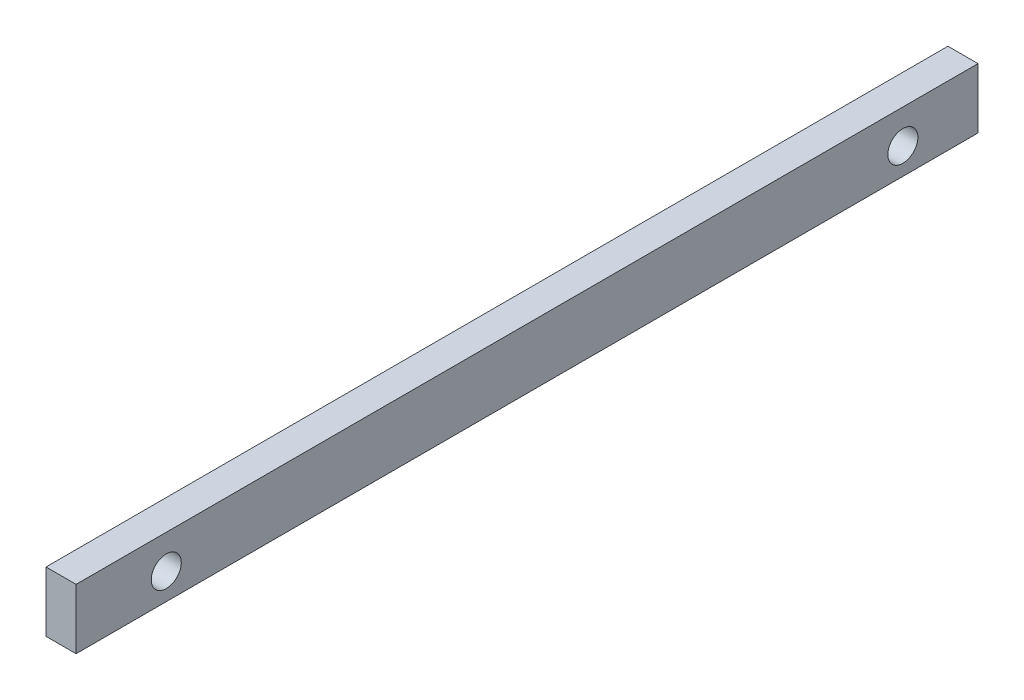
ISO-10303-21;
HEADER;
FILE_DESCRIPTION(('STEP AP214'),'2;1');
FILE_NAME('part.step','',(''),(''),'','','');
FILE_SCHEMA(('AUTOMOTIVE_DESIGN { 1 0 10303 214 1 1 1 1 }'));
ENDSEC;
DATA;
#1=APPLICATION_CONTEXT('core data for automotive mechanical design processes');
#2=APPLICATION_PROTOCOL_DEFINITION('international standard','automotive_design',2000,#1);
#3=PRODUCT_CONTEXT('',#1,'mechanical');
#4=PRODUCT('Part','Part','',(#3));
#5=PRODUCT_RELATED_PRODUCT_CATEGORY('part','',(#4));
#6=PRODUCT_DEFINITION_FORMATION('','',#4);
#7=PRODUCT_DEFINITION_CONTEXT('part definition',#1,'design');
#8=PRODUCT_DEFINITION('design','',#6,#7);
#9=PRODUCT_DEFINITION_SHAPE('','',#8);
#10=(LENGTH_UNIT() NAMED_UNIT(*) SI_UNIT(.MILLI.,.METRE.));
#11=(NAMED_UNIT(*) PLANE_ANGLE_UNIT() SI_UNIT($,.RADIAN.));
#12=(NAMED_UNIT(*) SI_UNIT($,.STERADIAN.) SOLID_ANGLE_UNIT());
#13=UNCERTAINTY_MEASURE_WITH_UNIT(LENGTH_MEASURE(1.E-05),#10,'distance_accuracy_value','');
#14=(GEOMETRIC_REPRESENTATION_CONTEXT(3) GLOBAL_UNCERTAINTY_ASSIGNED_CONTEXT((#13)) GLOBAL_UNIT_ASSIGNED_CONTEXT((#10,
#11,#12)) REPRESENTATION_CONTEXT('',''));
#15=CARTESIAN_POINT('',(0.,0.,0.));
#16=DIRECTION('',(0.,0.,1.));
#17=DIRECTION('',(1.,0.,0.));
#18=AXIS2_PLACEMENT_3D('',#15,#16,#17);
#19=CARTESIAN_POINT('',(4.,0.,0.));
#20=DIRECTION('',(1.,0.,0.));
#21=DIRECTION('',(0.,0.,-1.));
#22=AXIS2_PLACEMENT_3D('',#19,#20,#21);
#23=PLANE('',#22);
#24=CARTESIAN_POINT('',(4.,0.827466255373061,28.137341684183));
#25=DIRECTION('',(1.,0.,0.));
#26=DIRECTION('',(0.,0.,-1.));
#27=AXIS2_PLACEMENT_3D('',#24,#25,#26);
#28=CIRCLE('',#27,2.);
#29=CARTESIAN_POINT('',(4.,0.827466255373061,26.137341684183));
#30=VERTEX_POINT('',#29);
#31=EDGE_CURVE('E100',#30,#30,#28,.T.);
#32=ORIENTED_EDGE('',*,*,#31,.F.);
#33=EDGE_LOOP('',(#32));
#34=FACE_BOUND('',#33,.T.);
#35=DIRECTION('',(0.,-1.,0.));
#36=VECTOR('',#35,1.);
#37=CARTESIAN_POINT('',(4.,5.31595867682489,40.137341684183));
#38=LINE('',#37,#36);
#39=CARTESIAN_POINT('',(4.,5.31595867682489,40.137341684183));
#40=VERTEX_POINT('',#39);
#41=CARTESIAN_POINT('',(4.,-2.68404132317511,40.137341684183));
#42=VERTEX_POINT('',#41);
#43=EDGE_CURVE('E85',#40,#42,#38,.T.);
#44=ORIENTED_EDGE('',*,*,#43,.T.);
#45=DIRECTION('',(0.,0.,-1.));
#46=VECTOR('',#45,1.);
#47=CARTESIAN_POINT('',(4.,-2.68404132317511,40.137341684183));
#48=LINE('',#47,#46);
#49=CARTESIAN_POINT('',(4.,-2.68404132317511,-79.862658315817));
#50=VERTEX_POINT('',#49);
#51=EDGE_CURVE('E80',#42,#50,#48,.T.);
#52=ORIENTED_EDGE('',*,*,#51,.T.);
#53=DIRECTION('',(0.,1.,0.));
#54=VECTOR('',#53,1.);
#55=CARTESIAN_POINT('',(4.,5.31595867682489,-79.862658315817));
#56=LINE('',#55,#54);
#57=CARTESIAN_POINT('',(4.,5.31595867682489,-79.862658315817));
#58=VERTEX_POINT('',#57);
#59=EDGE_CURVE('E83',#50,#58,#56,.T.);
#60=ORIENTED_EDGE('',*,*,#59,.T.);
#61=DIRECTION('',(0.,0.,1.));
#62=VECTOR('',#61,1.);
#63=CARTESIAN_POINT('',(4.,5.31595867682489,40.137341684183));
#64=LINE('',#63,#62);
#65=EDGE_CURVE('E50',#58,#40,#64,.T.);
#66=ORIENTED_EDGE('',*,*,#65,.T.);
#67=EDGE_LOOP('',(#44,#52,#60,#66));
#68=FACE_BOUND('',#67,.T.);
#69=CARTESIAN_POINT('',(4.,0.827466255373088,-69.862658315817));
#70=DIRECTION('',(1.,0.,0.));
#71=DIRECTION('',(0.,0.,-1.));
#72=AXIS2_PLACEMENT_3D('',#69,#70,#71);
#73=CIRCLE('',#72,2.);
#74=CARTESIAN_POINT('',(4.,0.827466255373088,-71.862658315817));
#75=VERTEX_POINT('',#74);
#76=EDGE_CURVE('E115',#75,#75,#73,.T.);
#77=ORIENTED_EDGE('',*,*,#76,.F.);
#78=EDGE_LOOP('',(#77));
#79=FACE_BOUND('',#78,.T.);
#80=ADVANCED_FACE('F33',(#34,#68,#79),#23,.T.);
#81=CARTESIAN_POINT('',(0.,0.,0.));
#82=DIRECTION('',(1.,0.,0.));
#83=DIRECTION('',(0.,0.,-1.));
#84=AXIS2_PLACEMENT_3D('',#81,#82,#83);
#85=PLANE('',#84);
#86=DIRECTION('',(0.,-1.,0.));
#87=VECTOR('',#86,1.);
#88=CARTESIAN_POINT('',(0.,5.31595867682489,40.137341684183));
#89=LINE('',#88,#87);
#90=CARTESIAN_POINT('',(0.,5.31595867682489,40.137341684183));
#91=VERTEX_POINT('',#90);
#92=CARTESIAN_POINT('',(0.,-2.68404132317511,40.137341684183));
#93=VERTEX_POINT('',#92);
#94=EDGE_CURVE('E97',#91,#93,#89,.T.);
#95=ORIENTED_EDGE('',*,*,#94,.F.);
#96=DIRECTION('',(0.,0.,1.));
#97=VECTOR('',#96,1.);
#98=CARTESIAN_POINT('',(0.,5.31595867682489,40.137341684183));
#99=LINE('',#98,#97);
#100=CARTESIAN_POINT('',(0.,5.31595867682489,-79.862658315817));
#101=VERTEX_POINT('',#100);
#102=EDGE_CURVE('E73',#101,#91,#99,.T.);
#103=ORIENTED_EDGE('',*,*,#102,.F.);
#104=DIRECTION('',(0.,1.,0.));
#105=VECTOR('',#104,1.);
#106=CARTESIAN_POINT('',(0.,5.31595867682489,-79.862658315817));
#107=LINE('',#106,#105);
#108=CARTESIAN_POINT('',(0.,-2.68404132317511,-79.862658315817));
#109=VERTEX_POINT('',#108);
#110=EDGE_CURVE('E67',#109,#101,#107,.T.);
#111=ORIENTED_EDGE('',*,*,#110,.F.);
#112=DIRECTION('',(0.,0.,-1.));
#113=VECTOR('',#112,1.);
#114=CARTESIAN_POINT('',(0.,-2.68404132317511,40.137341684183));
#115=LINE('',#114,#113);
#116=EDGE_CURVE('E89',#93,#109,#115,.T.);
#117=ORIENTED_EDGE('',*,*,#116,.F.);
#118=EDGE_LOOP('',(#95,#103,#111,#117));
#119=FACE_BOUND('',#118,.T.);
#120=CARTESIAN_POINT('',(0.,0.827466255373061,28.137341684183));
#121=DIRECTION('',(1.,0.,0.));
#122=DIRECTION('',(0.,0.,-1.));
#123=AXIS2_PLACEMENT_3D('',#120,#121,#122);
#124=CIRCLE('',#123,2.);
#125=CARTESIAN_POINT('',(0.,0.827466255373061,26.137341684183));
#126=VERTEX_POINT('',#125);
#127=EDGE_CURVE('E112',#126,#126,#124,.T.);
#128=ORIENTED_EDGE('',*,*,#127,.T.);
#129=EDGE_LOOP('',(#128));
#130=FACE_BOUND('',#129,.T.);
#131=CARTESIAN_POINT('',(0.,0.827466255373088,-69.862658315817));
#132=DIRECTION('',(1.,0.,0.));
#133=DIRECTION('',(0.,0.,-1.));
#134=AXIS2_PLACEMENT_3D('',#131,#132,#133);
#135=CIRCLE('',#134,2.);
#136=CARTESIAN_POINT('',(0.,0.827466255373088,-71.862658315817));
#137=VERTEX_POINT('',#136);
#138=EDGE_CURVE('E118',#137,#137,#135,.T.);
#139=ORIENTED_EDGE('',*,*,#138,.T.);
#140=EDGE_LOOP('',(#139));
#141=FACE_BOUND('',#140,.T.);
#142=ADVANCED_FACE('F108',(#119,#130,#141),#85,.F.);
#143=CARTESIAN_POINT('',(4.,5.31595867682489,40.137341684183));
#144=DIRECTION('',(0.,0.,-1.));
#145=DIRECTION('',(-1.,0.,0.));
#146=AXIS2_PLACEMENT_3D('',#143,#144,#145);
#147=PLANE('',#146);
#148=ORIENTED_EDGE('',*,*,#94,.T.);
#149=DIRECTION('',(-1.,0.,0.));
#150=VECTOR('',#149,1.);
#151=CARTESIAN_POINT('',(4.,-2.68404132317511,40.137341684183));
#152=LINE('',#151,#150);
#153=EDGE_CURVE('E11',#42,#93,#152,.T.);
#154=ORIENTED_EDGE('',*,*,#153,.F.);
#155=ORIENTED_EDGE('',*,*,#43,.F.);
#156=DIRECTION('',(-1.,0.,0.));
#157=VECTOR('',#156,1.);
#158=CARTESIAN_POINT('',(4.,5.31595867682489,40.137341684183));
#159=LINE('',#158,#157);
#160=EDGE_CURVE('E93',#40,#91,#159,.T.);
#161=ORIENTED_EDGE('',*,*,#160,.T.);
#162=EDGE_LOOP('',(#148,#154,#155,#161));
#163=FACE_BOUND('',#162,.T.);
#164=ADVANCED_FACE('F35',(#163),#147,.F.);
#165=CARTESIAN_POINT('',(4.,-2.68404132317511,40.137341684183));
#166=DIRECTION('',(0.,1.,0.));
#167=DIRECTION('',(0.,0.,1.));
#168=AXIS2_PLACEMENT_3D('',#165,#166,#167);
#169=PLANE('',#168);
#170=ORIENTED_EDGE('',*,*,#116,.T.);
#171=DIRECTION('',(-1.,0.,0.));
#172=VECTOR('',#171,1.);
#173=CARTESIAN_POINT('',(4.,-2.68404132317511,-79.862658315817));
#174=LINE('',#173,#172);
#175=EDGE_CURVE('E42',#50,#109,#174,.T.);
#176=ORIENTED_EDGE('',*,*,#175,.F.);
#177=ORIENTED_EDGE('',*,*,#51,.F.);
#178=ORIENTED_EDGE('',*,*,#153,.T.);
#179=EDGE_LOOP('',(#170,#176,#177,#178));
#180=FACE_BOUND('',#179,.T.);
#181=ADVANCED_FACE('F88',(#180),#169,.F.);
#182=CARTESIAN_POINT('',(4.,5.31595867682489,-79.862658315817));
#183=DIRECTION('',(0.,0.,1.));
#184=DIRECTION('',(1.,0.,0.));
#185=AXIS2_PLACEMENT_3D('',#182,#183,#184);
#186=PLANE('',#185);
#187=ORIENTED_EDGE('',*,*,#110,.T.);
#188=DIRECTION('',(-1.,0.,0.));
#189=VECTOR('',#188,1.);
#190=CARTESIAN_POINT('',(4.,5.31595867682489,-79.862658315817));
#191=LINE('',#190,#189);
#192=EDGE_CURVE('E90',#58,#101,#191,.T.);
#193=ORIENTED_EDGE('',*,*,#192,.F.);
#194=ORIENTED_EDGE('',*,*,#59,.F.);
#195=ORIENTED_EDGE('',*,*,#175,.T.);
#196=EDGE_LOOP('',(#187,#193,#194,#195));
#197=FACE_BOUND('',#196,.T.);
#198=ADVANCED_FACE('F91',(#197),#186,.F.);
#199=CARTESIAN_POINT('',(4.,5.31595867682489,40.137341684183));
#200=DIRECTION('',(0.,-1.,0.));
#201=DIRECTION('',(0.,0.,-1.));
#202=AXIS2_PLACEMENT_3D('',#199,#200,#201);
#203=PLANE('',#202);
#204=ORIENTED_EDGE('',*,*,#102,.T.);
#205=ORIENTED_EDGE('',*,*,#160,.F.);
#206=ORIENTED_EDGE('',*,*,#65,.F.);
#207=ORIENTED_EDGE('',*,*,#192,.T.);
#208=EDGE_LOOP('',(#204,#205,#206,#207));
#209=FACE_BOUND('',#208,.T.);
#210=ADVANCED_FACE('F105',(#209),#203,.F.);
#211=CARTESIAN_POINT('',(4.,0.827466255373061,28.137341684183));
#212=DIRECTION('',(-1.,0.,0.));
#213=DIRECTION('',(0.,0.,1.));
#214=AXIS2_PLACEMENT_3D('',#211,#212,#213);
#215=CYLINDRICAL_SURFACE('',#214,2.);
#216=ORIENTED_EDGE('',*,*,#31,.T.);
#217=EDGE_LOOP('',(#216));
#218=FACE_BOUND('',#217,.T.);
#219=ORIENTED_EDGE('',*,*,#127,.F.);
#220=EDGE_LOOP('',(#219));
#221=FACE_BOUND('',#220,.T.);
#222=ADVANCED_FACE('F135',(#218,#221),#215,.F.);
#223=CARTESIAN_POINT('',(4.,0.827466255373088,-69.862658315817));
#224=DIRECTION('',(-1.,0.,0.));
#225=DIRECTION('',(0.,0.,1.));
#226=AXIS2_PLACEMENT_3D('',#223,#224,#225);
#227=CYLINDRICAL_SURFACE('',#226,2.);
#228=ORIENTED_EDGE('',*,*,#76,.T.);
#229=EDGE_LOOP('',(#228));
#230=FACE_BOUND('',#229,.T.);
#231=ORIENTED_EDGE('',*,*,#138,.F.);
#232=EDGE_LOOP('',(#231));
#233=FACE_BOUND('',#232,.T.);
#234=ADVANCED_FACE('F124',(#230,#233),#227,.F.);
#235=CLOSED_SHELL('',(#80,#142,#164,#181,#198,#210,#222,#234));
#236=MANIFOLD_SOLID_BREP('B2',#235);
#237=ADVANCED_BREP_SHAPE_REPRESENTATION('',(#18,#236),#14);
#238=SHAPE_DEFINITION_REPRESENTATION(#9,#237);
ENDSEC;
END-ISO-10303-21;
